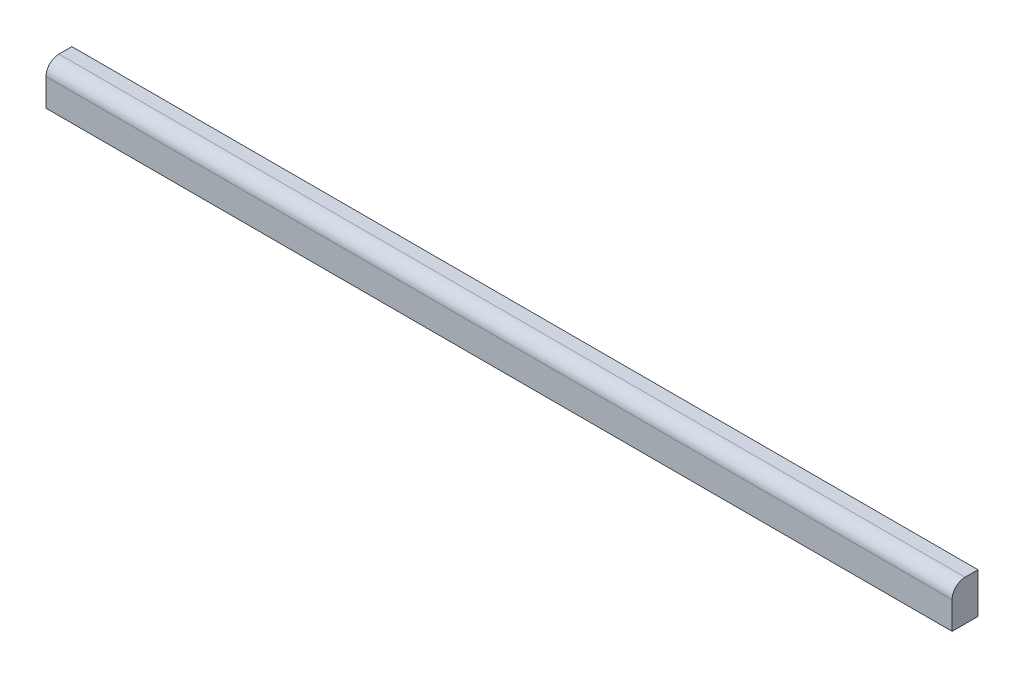
ISO-10303-21;
HEADER;
FILE_DESCRIPTION(('STEP AP214'),'2;1');
FILE_NAME('part.step','',(''),(''),'','','');
FILE_SCHEMA(('AUTOMOTIVE_DESIGN { 1 0 10303 214 1 1 1 1 }'));
ENDSEC;
DATA;
#1=APPLICATION_CONTEXT('core data for automotive mechanical design processes');
#2=APPLICATION_PROTOCOL_DEFINITION('international standard','automotive_design',2000,#1);
#3=PRODUCT_CONTEXT('',#1,'mechanical');
#4=PRODUCT('Part','Part','',(#3));
#5=PRODUCT_RELATED_PRODUCT_CATEGORY('part','',(#4));
#6=PRODUCT_DEFINITION_FORMATION('','',#4);
#7=PRODUCT_DEFINITION_CONTEXT('part definition',#1,'design');
#8=PRODUCT_DEFINITION('design','',#6,#7);
#9=PRODUCT_DEFINITION_SHAPE('','',#8);
#10=(LENGTH_UNIT() NAMED_UNIT(*) SI_UNIT(.MILLI.,.METRE.));
#11=(NAMED_UNIT(*) PLANE_ANGLE_UNIT() SI_UNIT($,.RADIAN.));
#12=(NAMED_UNIT(*) SI_UNIT($,.STERADIAN.) SOLID_ANGLE_UNIT());
#13=UNCERTAINTY_MEASURE_WITH_UNIT(LENGTH_MEASURE(1.E-05),#10,'distance_accuracy_value','');
#14=(GEOMETRIC_REPRESENTATION_CONTEXT(3) GLOBAL_UNCERTAINTY_ASSIGNED_CONTEXT((#13)) GLOBAL_UNIT_ASSIGNED_CONTEXT((#10,
#11,#12)) REPRESENTATION_CONTEXT('',''));
#15=CARTESIAN_POINT('',(0.,0.,0.));
#16=DIRECTION('',(0.,0.,1.));
#17=DIRECTION('',(1.,0.,0.));
#18=AXIS2_PLACEMENT_3D('',#15,#16,#17);
#19=CARTESIAN_POINT('',(280.,1.38777878078145E-13,16.));
#20=DIRECTION('',(-1.,0.,0.));
#21=DIRECTION('',(0.,0.,1.));
#22=AXIS2_PLACEMENT_3D('',#19,#20,#21);
#23=PLANE('',#22);
#24=DIRECTION('',(0.,0.,-1.));
#25=VECTOR('',#24,1.);
#26=CARTESIAN_POINT('',(280.,25.0000000000001,16.));
#27=LINE('',#26,#25);
#28=CARTESIAN_POINT('',(280.,25.0000000000001,8.));
#29=VERTEX_POINT('',#28);
#30=CARTESIAN_POINT('',(280.,25.0000000000001,0.));
#31=VERTEX_POINT('',#30);
#32=EDGE_CURVE('E123',#29,#31,#27,.T.);
#33=ORIENTED_EDGE('',*,*,#32,.F.);
#34=CARTESIAN_POINT('',(280.,17.0000000000001,8.));
#35=DIRECTION('',(-1.,0.,0.));
#36=DIRECTION('',(0.,0.,1.));
#37=AXIS2_PLACEMENT_3D('',#34,#35,#36);
#38=CIRCLE('',#37,8.);
#39=CARTESIAN_POINT('',(280.,17.0000000000001,16.));
#40=VERTEX_POINT('',#39);
#41=EDGE_CURVE('E11',#29,#40,#38,.F.);
#42=ORIENTED_EDGE('',*,*,#41,.T.);
#43=DIRECTION('',(0.,1.,0.));
#44=VECTOR('',#43,1.);
#45=CARTESIAN_POINT('',(280.,1.38777878078145E-13,16.));
#46=LINE('',#45,#44);
#47=CARTESIAN_POINT('',(280.,1.38777878078145E-13,16.));
#48=VERTEX_POINT('',#47);
#49=EDGE_CURVE('E94',#48,#40,#46,.T.);
#50=ORIENTED_EDGE('',*,*,#49,.F.);
#51=DIRECTION('',(0.,0.,-1.));
#52=VECTOR('',#51,1.);
#53=CARTESIAN_POINT('',(280.,1.38777878078145E-13,16.));
#54=LINE('',#53,#52);
#55=CARTESIAN_POINT('',(280.,1.38777878078145E-13,0.));
#56=VERTEX_POINT('',#55);
#57=EDGE_CURVE('E104',#48,#56,#54,.T.);
#58=ORIENTED_EDGE('',*,*,#57,.T.);
#59=DIRECTION('',(0.,1.,0.));
#60=VECTOR('',#59,1.);
#61=CARTESIAN_POINT('',(280.,1.38777878078145E-13,0.));
#62=LINE('',#61,#60);
#63=EDGE_CURVE('E113',#56,#31,#62,.T.);
#64=ORIENTED_EDGE('',*,*,#63,.T.);
#65=EDGE_LOOP('',(#33,#42,#50,#58,#64));
#66=FACE_BOUND('',#65,.T.);
#67=ADVANCED_FACE('F41',(#66),#23,.F.);
#68=CARTESIAN_POINT('',(280.,25.0000000000001,16.));
#69=DIRECTION('',(0.,-1.,0.));
#70=DIRECTION('',(1.,0.,0.));
#71=AXIS2_PLACEMENT_3D('',#68,#69,#70);
#72=PLANE('',#71);
#73=DIRECTION('',(0.,0.,-1.));
#74=VECTOR('',#73,1.);
#75=CARTESIAN_POINT('',(-280.,25.,16.));
#76=LINE('',#75,#74);
#77=CARTESIAN_POINT('',(-280.,25.,8.));
#78=VERTEX_POINT('',#77);
#79=CARTESIAN_POINT('',(-280.,25.,0.));
#80=VERTEX_POINT('',#79);
#81=EDGE_CURVE('E103',#78,#80,#76,.T.);
#82=ORIENTED_EDGE('',*,*,#81,.F.);
#83=DIRECTION('',(-1.,0.,0.));
#84=VECTOR('',#83,1.);
#85=CARTESIAN_POINT('',(280.,25.0000000000001,8.));
#86=LINE('',#85,#84);
#87=EDGE_CURVE('E49',#78,#29,#86,.F.);
#88=ORIENTED_EDGE('',*,*,#87,.T.);
#89=ORIENTED_EDGE('',*,*,#32,.T.);
#90=DIRECTION('',(-1.,0.,0.));
#91=VECTOR('',#90,1.);
#92=CARTESIAN_POINT('',(280.,25.0000000000001,0.));
#93=LINE('',#92,#91);
#94=EDGE_CURVE('E116',#31,#80,#93,.T.);
#95=ORIENTED_EDGE('',*,*,#94,.T.);
#96=EDGE_LOOP('',(#82,#88,#89,#95));
#97=FACE_BOUND('',#96,.T.);
#98=ADVANCED_FACE('F127',(#97),#72,.F.);
#99=CARTESIAN_POINT('',(-280.,0.,16.));
#100=DIRECTION('',(1.,0.,0.));
#101=DIRECTION('',(0.,0.,-1.));
#102=AXIS2_PLACEMENT_3D('',#99,#100,#101);
#103=PLANE('',#102);
#104=DIRECTION('',(0.,-1.,0.));
#105=VECTOR('',#104,1.);
#106=CARTESIAN_POINT('',(-280.,0.,16.));
#107=LINE('',#106,#105);
#108=CARTESIAN_POINT('',(-280.,17.,16.));
#109=VERTEX_POINT('',#108);
#110=CARTESIAN_POINT('',(-280.,0.,16.));
#111=VERTEX_POINT('',#110);
#112=EDGE_CURVE('E85',#109,#111,#107,.T.);
#113=ORIENTED_EDGE('',*,*,#112,.F.);
#114=CARTESIAN_POINT('',(-280.,17.,8.));
#115=DIRECTION('',(1.,0.,0.));
#116=DIRECTION('',(0.,0.,-1.));
#117=AXIS2_PLACEMENT_3D('',#114,#115,#116);
#118=CIRCLE('',#117,8.);
#119=EDGE_CURVE('E63',#109,#78,#118,.F.);
#120=ORIENTED_EDGE('',*,*,#119,.T.);
#121=ORIENTED_EDGE('',*,*,#81,.T.);
#122=DIRECTION('',(0.,-1.,0.));
#123=VECTOR('',#122,1.);
#124=CARTESIAN_POINT('',(-280.,0.,0.));
#125=LINE('',#124,#123);
#126=CARTESIAN_POINT('',(-280.,0.,0.));
#127=VERTEX_POINT('',#126);
#128=EDGE_CURVE('E100',#80,#127,#125,.T.);
#129=ORIENTED_EDGE('',*,*,#128,.T.);
#130=DIRECTION('',(0.,0.,-1.));
#131=VECTOR('',#130,1.);
#132=CARTESIAN_POINT('',(-280.,0.,16.));
#133=LINE('',#132,#131);
#134=EDGE_CURVE('E97',#111,#127,#133,.T.);
#135=ORIENTED_EDGE('',*,*,#134,.F.);
#136=EDGE_LOOP('',(#113,#120,#121,#129,#135));
#137=FACE_BOUND('',#136,.T.);
#138=ADVANCED_FACE('F98',(#137),#103,.F.);
#139=CARTESIAN_POINT('',(280.,1.38777878078145E-13,16.));
#140=DIRECTION('',(0.,1.,0.));
#141=DIRECTION('',(-1.,0.,0.));
#142=AXIS2_PLACEMENT_3D('',#139,#140,#141);
#143=PLANE('',#142);
#144=DIRECTION('',(1.,0.,0.));
#145=VECTOR('',#144,1.);
#146=CARTESIAN_POINT('',(280.,1.38777878078145E-13,0.));
#147=LINE('',#146,#145);
#148=EDGE_CURVE('E120',#127,#56,#147,.T.);
#149=ORIENTED_EDGE('',*,*,#148,.T.);
#150=ORIENTED_EDGE('',*,*,#57,.F.);
#151=DIRECTION('',(1.,0.,0.));
#152=VECTOR('',#151,1.);
#153=CARTESIAN_POINT('',(280.,1.38777878078145E-13,16.));
#154=LINE('',#153,#152);
#155=EDGE_CURVE('E90',#111,#48,#154,.T.);
#156=ORIENTED_EDGE('',*,*,#155,.F.);
#157=ORIENTED_EDGE('',*,*,#134,.T.);
#158=EDGE_LOOP('',(#149,#150,#156,#157));
#159=FACE_BOUND('',#158,.T.);
#160=ADVANCED_FACE('F106',(#159),#143,.F.);
#161=CARTESIAN_POINT('',(0.,0.,16.));
#162=DIRECTION('',(0.,0.,1.));
#163=DIRECTION('',(1.,0.,0.));
#164=AXIS2_PLACEMENT_3D('',#161,#162,#163);
#165=PLANE('',#164);
#166=ORIENTED_EDGE('',*,*,#49,.T.);
#167=DIRECTION('',(-1.,0.,0.));
#168=VECTOR('',#167,1.);
#169=CARTESIAN_POINT('',(-280.,17.,16.));
#170=LINE('',#169,#168);
#171=EDGE_CURVE('E93',#40,#109,#170,.T.);
#172=ORIENTED_EDGE('',*,*,#171,.T.);
#173=ORIENTED_EDGE('',*,*,#112,.T.);
#174=ORIENTED_EDGE('',*,*,#155,.T.);
#175=EDGE_LOOP('',(#166,#172,#173,#174));
#176=FACE_BOUND('',#175,.T.);
#177=ADVANCED_FACE('F88',(#176),#165,.T.);
#178=CARTESIAN_POINT('',(0.,0.,0.));
#179=DIRECTION('',(0.,0.,1.));
#180=DIRECTION('',(1.,0.,0.));
#181=AXIS2_PLACEMENT_3D('',#178,#179,#180);
#182=PLANE('',#181);
#183=ORIENTED_EDGE('',*,*,#63,.F.);
#184=ORIENTED_EDGE('',*,*,#148,.F.);
#185=ORIENTED_EDGE('',*,*,#128,.F.);
#186=ORIENTED_EDGE('',*,*,#94,.F.);
#187=EDGE_LOOP('',(#183,#184,#185,#186));
#188=FACE_BOUND('',#187,.T.);
#189=ADVANCED_FACE('F132',(#188),#182,.F.);
#190=CARTESIAN_POINT('',(0.,17.,8.));
#191=DIRECTION('',(1.,0.,0.));
#192=DIRECTION('',(0.,1.,0.));
#193=AXIS2_PLACEMENT_3D('',#190,#191,#192);
#194=CYLINDRICAL_SURFACE('',#193,8.);
#195=ORIENTED_EDGE('',*,*,#41,.F.);
#196=ORIENTED_EDGE('',*,*,#87,.F.);
#197=ORIENTED_EDGE('',*,*,#119,.F.);
#198=ORIENTED_EDGE('',*,*,#171,.F.);
#199=EDGE_LOOP('',(#195,#196,#197,#198));
#200=FACE_BOUND('',#199,.T.);
#201=ADVANCED_FACE('F43',(#200),#194,.T.);
#202=CLOSED_SHELL('',(#67,#98,#138,#160,#177,#189,#201));
#203=MANIFOLD_SOLID_BREP('B2',#202);
#204=ADVANCED_BREP_SHAPE_REPRESENTATION('',(#18,#203),#14);
#205=SHAPE_DEFINITION_REPRESENTATION(#9,#204);
ENDSEC;
END-ISO-10303-21;
